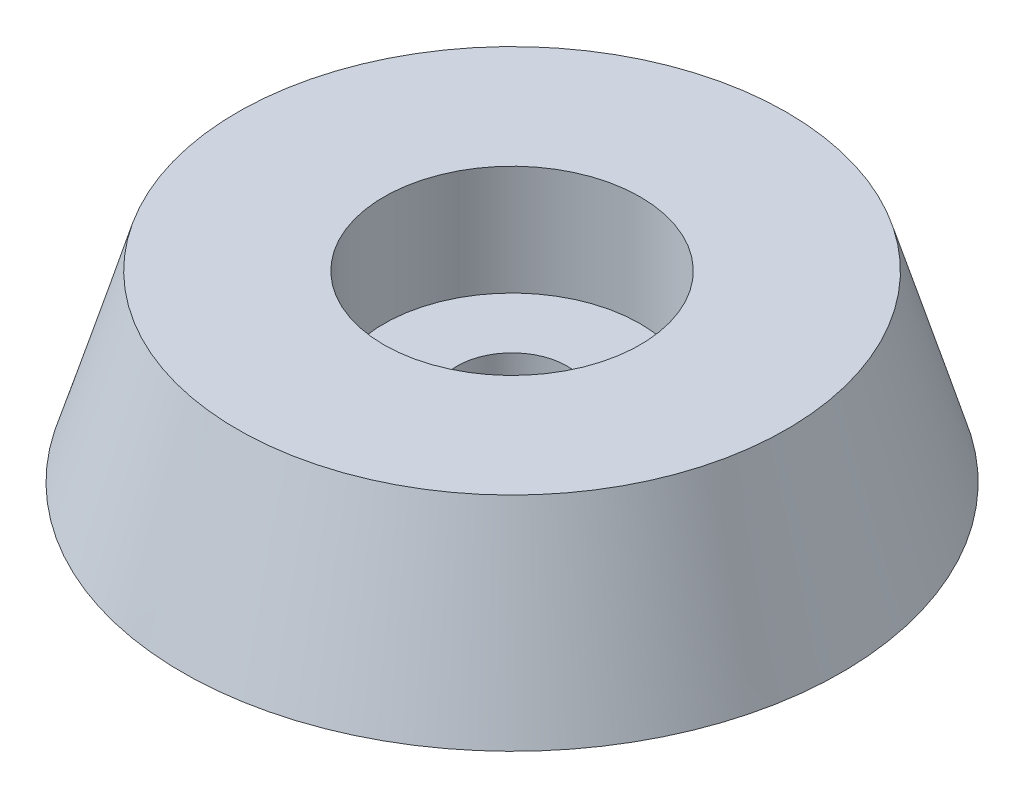
ISO-10303-21;
HEADER;
FILE_DESCRIPTION(('STEP AP214'),'2;1');
FILE_NAME('part.step','',(''),(''),'','','');
FILE_SCHEMA(('AUTOMOTIVE_DESIGN { 1 0 10303 214 1 1 1 1 }'));
ENDSEC;
DATA;
#1=APPLICATION_CONTEXT('core data for automotive mechanical design processes');
#2=APPLICATION_PROTOCOL_DEFINITION('international standard','automotive_design',2000,#1);
#3=PRODUCT_CONTEXT('',#1,'mechanical');
#4=PRODUCT('Part','Part','',(#3));
#5=PRODUCT_RELATED_PRODUCT_CATEGORY('part','',(#4));
#6=PRODUCT_DEFINITION_FORMATION('','',#4);
#7=PRODUCT_DEFINITION_CONTEXT('part definition',#1,'design');
#8=PRODUCT_DEFINITION('design','',#6,#7);
#9=PRODUCT_DEFINITION_SHAPE('','',#8);
#10=(LENGTH_UNIT() NAMED_UNIT(*) SI_UNIT(.MILLI.,.METRE.));
#11=(NAMED_UNIT(*) PLANE_ANGLE_UNIT() SI_UNIT($,.RADIAN.));
#12=(NAMED_UNIT(*) SI_UNIT($,.STERADIAN.) SOLID_ANGLE_UNIT());
#13=UNCERTAINTY_MEASURE_WITH_UNIT(LENGTH_MEASURE(1.E-05),#10,'distance_accuracy_value','');
#14=(GEOMETRIC_REPRESENTATION_CONTEXT(3) GLOBAL_UNCERTAINTY_ASSIGNED_CONTEXT((#13)) GLOBAL_UNIT_ASSIGNED_CONTEXT((#10,
#11,#12)) REPRESENTATION_CONTEXT('',''));
#15=CARTESIAN_POINT('',(0.,0.,0.));
#16=DIRECTION('',(0.,0.,1.));
#17=DIRECTION('',(1.,0.,0.));
#18=AXIS2_PLACEMENT_3D('',#15,#16,#17);
#19=CARTESIAN_POINT('',(9.,0.,0.));
#20=DIRECTION('',(0.,-1.,0.));
#21=DIRECTION('',(0.,0.,-1.));
#22=AXIS2_PLACEMENT_3D('',#19,#20,#21);
#23=PLANE('',#22);
#24=CARTESIAN_POINT('',(0.,0.,0.));
#25=DIRECTION('',(0.,-1.,0.));
#26=DIRECTION('',(0.,0.,-1.));
#27=AXIS2_PLACEMENT_3D('',#24,#25,#26);
#28=CIRCLE('',#27,9.);
#29=CARTESIAN_POINT('',(0.,0.,-9.));
#30=VERTEX_POINT('',#29);
#31=EDGE_CURVE('E59',#30,#30,#28,.T.);
#32=ORIENTED_EDGE('',*,*,#31,.T.);
#33=EDGE_LOOP('',(#32));
#34=FACE_BOUND('',#33,.T.);
#35=CARTESIAN_POINT('',(0.,0.,0.));
#36=DIRECTION('',(0.,-1.,0.));
#37=DIRECTION('',(0.,0.,-1.));
#38=AXIS2_PLACEMENT_3D('',#35,#36,#37);
#39=CIRCLE('',#38,1.5);
#40=CARTESIAN_POINT('',(0.,0.,-1.5));
#41=VERTEX_POINT('',#40);
#42=EDGE_CURVE('E10',#41,#41,#39,.T.);
#43=ORIENTED_EDGE('',*,*,#42,.F.);
#44=EDGE_LOOP('',(#43));
#45=FACE_BOUND('',#44,.T.);
#46=ADVANCED_FACE('F37',(#34,#45),#23,.T.);
#47=CARTESIAN_POINT('',(0.,0.,0.));
#48=DIRECTION('',(0.,-1.,0.));
#49=DIRECTION('',(0.,0.,-1.));
#50=AXIS2_PLACEMENT_3D('',#47,#48,#49);
#51=CYLINDRICAL_SURFACE('',#50,1.5);
#52=ORIENTED_EDGE('',*,*,#42,.T.);
#53=EDGE_LOOP('',(#52));
#54=FACE_BOUND('',#53,.T.);
#55=CARTESIAN_POINT('',(0.,2.,0.));
#56=DIRECTION('',(0.,-1.,0.));
#57=DIRECTION('',(0.,0.,-1.));
#58=AXIS2_PLACEMENT_3D('',#55,#56,#57);
#59=CIRCLE('',#58,1.5);
#60=CARTESIAN_POINT('',(0.,2.,-1.5));
#61=VERTEX_POINT('',#60);
#62=EDGE_CURVE('E43',#61,#61,#59,.T.);
#63=ORIENTED_EDGE('',*,*,#62,.F.);
#64=EDGE_LOOP('',(#63));
#65=FACE_BOUND('',#64,.T.);
#66=ADVANCED_FACE('F77',(#54,#65),#51,.F.);
#67=CARTESIAN_POINT('',(1.5,2.,0.));
#68=DIRECTION('',(0.,1.,0.));
#69=DIRECTION('',(0.,0.,1.));
#70=AXIS2_PLACEMENT_3D('',#67,#68,#69);
#71=PLANE('',#70);
#72=ORIENTED_EDGE('',*,*,#62,.T.);
#73=EDGE_LOOP('',(#72));
#74=FACE_BOUND('',#73,.T.);
#75=CARTESIAN_POINT('',(0.,2.,0.));
#76=DIRECTION('',(0.,-1.,0.));
#77=DIRECTION('',(0.,0.,-1.));
#78=AXIS2_PLACEMENT_3D('',#75,#76,#77);
#79=CIRCLE('',#78,3.5);
#80=CARTESIAN_POINT('',(0.,2.,-3.5));
#81=VERTEX_POINT('',#80);
#82=EDGE_CURVE('E47',#81,#81,#79,.T.);
#83=ORIENTED_EDGE('',*,*,#82,.F.);
#84=EDGE_LOOP('',(#83));
#85=FACE_BOUND('',#84,.T.);
#86=ADVANCED_FACE('F81',(#74,#85),#71,.T.);
#87=CARTESIAN_POINT('',(0.,0.,0.));
#88=DIRECTION('',(0.,-1.,0.));
#89=DIRECTION('',(0.,0.,-1.));
#90=AXIS2_PLACEMENT_3D('',#87,#88,#89);
#91=CYLINDRICAL_SURFACE('',#90,3.5);
#92=ORIENTED_EDGE('',*,*,#82,.T.);
#93=EDGE_LOOP('',(#92));
#94=FACE_BOUND('',#93,.T.);
#95=CARTESIAN_POINT('',(0.,5.,0.));
#96=DIRECTION('',(0.,-1.,0.));
#97=DIRECTION('',(0.,0.,-1.));
#98=AXIS2_PLACEMENT_3D('',#95,#96,#97);
#99=CIRCLE('',#98,3.5);
#100=CARTESIAN_POINT('',(0.,5.,-3.5));
#101=VERTEX_POINT('',#100);
#102=EDGE_CURVE('E51',#101,#101,#99,.T.);
#103=ORIENTED_EDGE('',*,*,#102,.F.);
#104=EDGE_LOOP('',(#103));
#105=FACE_BOUND('',#104,.T.);
#106=ADVANCED_FACE('F73',(#94,#105),#91,.F.);
#107=CARTESIAN_POINT('',(3.5,5.,0.));
#108=DIRECTION('',(0.,1.,0.));
#109=DIRECTION('',(0.,0.,1.));
#110=AXIS2_PLACEMENT_3D('',#107,#108,#109);
#111=PLANE('',#110);
#112=ORIENTED_EDGE('',*,*,#102,.T.);
#113=EDGE_LOOP('',(#112));
#114=FACE_BOUND('',#113,.T.);
#115=CARTESIAN_POINT('',(0.,5.,0.));
#116=DIRECTION('',(0.,-1.,0.));
#117=DIRECTION('',(0.,0.,-1.));
#118=AXIS2_PLACEMENT_3D('',#115,#116,#117);
#119=CIRCLE('',#118,7.5);
#120=CARTESIAN_POINT('',(0.,5.,-7.5));
#121=VERTEX_POINT('',#120);
#122=EDGE_CURVE('E56',#121,#121,#119,.T.);
#123=ORIENTED_EDGE('',*,*,#122,.F.);
#124=EDGE_LOOP('',(#123));
#125=FACE_BOUND('',#124,.T.);
#126=ADVANCED_FACE('F67',(#114,#125),#111,.T.);
#127=CARTESIAN_POINT('',(0.,0.,0.));
#128=DIRECTION('',(0.,-1.,0.));
#129=DIRECTION('',(0.,0.,-1.));
#130=AXIS2_PLACEMENT_3D('',#127,#128,#129);
#131=CONICAL_SURFACE('',#130,9.,0.291456794477867);
#132=ORIENTED_EDGE('',*,*,#122,.T.);
#133=EDGE_LOOP('',(#132));
#134=FACE_BOUND('',#133,.T.);
#135=ORIENTED_EDGE('',*,*,#31,.F.);
#136=EDGE_LOOP('',(#135));
#137=FACE_BOUND('',#136,.T.);
#138=ADVANCED_FACE('F65',(#134,#137),#131,.T.);
#139=CLOSED_SHELL('',(#46,#66,#86,#106,#126,#138));
#140=MANIFOLD_SOLID_BREP('B2',#139);
#141=ADVANCED_BREP_SHAPE_REPRESENTATION('',(#18,#140),#14);
#142=SHAPE_DEFINITION_REPRESENTATION(#9,#141);
ENDSEC;
END-ISO-10303-21;
